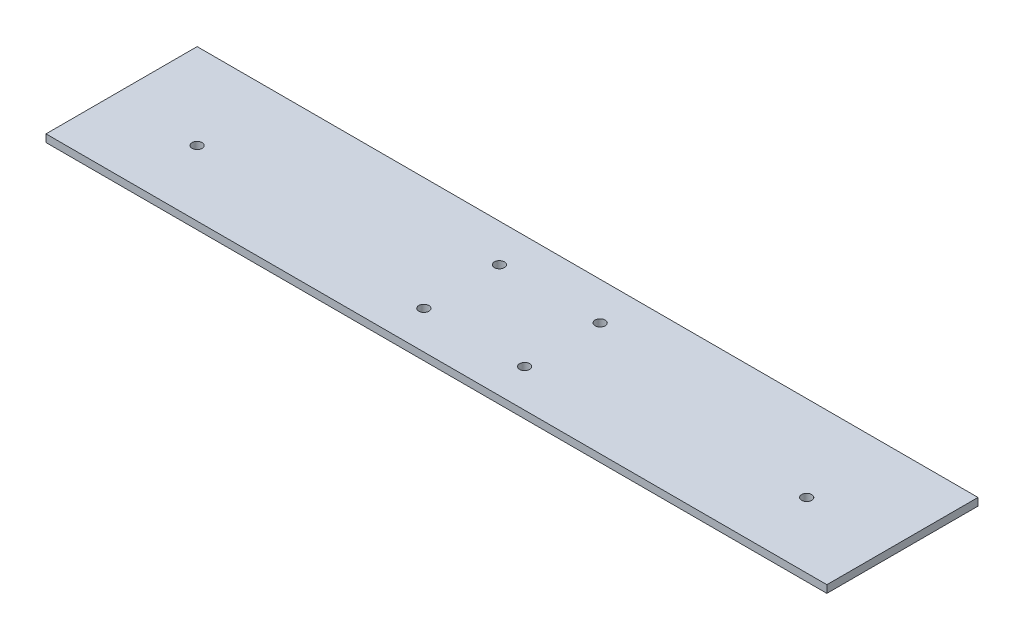
ISO-10303-21;
HEADER;
FILE_DESCRIPTION(('STEP AP214'),'2;1');
FILE_NAME('part.step','',(''),(''),'','','');
FILE_SCHEMA(('AUTOMOTIVE_DESIGN { 1 0 10303 214 1 1 1 1 }'));
ENDSEC;
DATA;
#1=APPLICATION_CONTEXT('core data for automotive mechanical design processes');
#2=APPLICATION_PROTOCOL_DEFINITION('international standard','automotive_design',2000,#1);
#3=PRODUCT_CONTEXT('',#1,'mechanical');
#4=PRODUCT('Part','Part','',(#3));
#5=PRODUCT_RELATED_PRODUCT_CATEGORY('part','',(#4));
#6=PRODUCT_DEFINITION_FORMATION('','',#4);
#7=PRODUCT_DEFINITION_CONTEXT('part definition',#1,'design');
#8=PRODUCT_DEFINITION('design','',#6,#7);
#9=PRODUCT_DEFINITION_SHAPE('','',#8);
#10=(LENGTH_UNIT() NAMED_UNIT(*) SI_UNIT(.MILLI.,.METRE.));
#11=(NAMED_UNIT(*) PLANE_ANGLE_UNIT() SI_UNIT($,.RADIAN.));
#12=(NAMED_UNIT(*) SI_UNIT($,.STERADIAN.) SOLID_ANGLE_UNIT());
#13=UNCERTAINTY_MEASURE_WITH_UNIT(LENGTH_MEASURE(1.E-05),#10,'distance_accuracy_value','');
#14=(GEOMETRIC_REPRESENTATION_CONTEXT(3) GLOBAL_UNCERTAINTY_ASSIGNED_CONTEXT((#13)) GLOBAL_UNIT_ASSIGNED_CONTEXT((#10,
#11,#12)) REPRESENTATION_CONTEXT('',''));
#15=CARTESIAN_POINT('',(0.,0.,0.));
#16=DIRECTION('',(0.,0.,1.));
#17=DIRECTION('',(1.,0.,0.));
#18=AXIS2_PLACEMENT_3D('',#15,#16,#17);
#19=CARTESIAN_POINT('',(0.,0.,0.));
#20=DIRECTION('',(0.,-1.,0.));
#21=DIRECTION('',(0.,0.,-1.));
#22=AXIS2_PLACEMENT_3D('',#19,#20,#21);
#23=PLANE('',#22);
#24=CARTESIAN_POINT('',(266.,0.,-26.));
#25=DIRECTION('',(0.,-1.,0.));
#26=DIRECTION('',(0.,0.,-1.));
#27=AXIS2_PLACEMENT_3D('',#24,#25,#26);
#28=CIRCLE('',#27,3.50000000000002);
#29=CARTESIAN_POINT('',(266.,0.,-29.5));
#30=VERTEX_POINT('',#29);
#31=EDGE_CURVE('E61',#30,#30,#28,.F.);
#32=ORIENTED_EDGE('',*,*,#31,.T.);
#33=EDGE_LOOP('',(#32));
#34=FACE_BOUND('',#33,.T.);
#35=CARTESIAN_POINT('',(125.,0.,-15.));
#36=DIRECTION('',(0.,1.,0.));
#37=DIRECTION('',(0.,0.,1.));
#38=AXIS2_PLACEMENT_3D('',#35,#36,#37);
#39=CIRCLE('',#38,2.);
#40=CARTESIAN_POINT('',(125.,0.,-13.));
#41=VERTEX_POINT('',#40);
#42=EDGE_CURVE('E180',#41,#41,#39,.T.);
#43=ORIENTED_EDGE('',*,*,#42,.T.);
#44=EDGE_LOOP('',(#43));
#45=FACE_BOUND('',#44,.T.);
#46=CARTESIAN_POINT('',(165.,0.,-15.));
#47=DIRECTION('',(0.,1.,0.));
#48=DIRECTION('',(0.,0.,1.));
#49=AXIS2_PLACEMENT_3D('',#46,#47,#48);
#50=CIRCLE('',#49,2.);
#51=CARTESIAN_POINT('',(165.,0.,-13.));
#52=VERTEX_POINT('',#51);
#53=EDGE_CURVE('E186',#52,#52,#50,.T.);
#54=ORIENTED_EDGE('',*,*,#53,.T.);
#55=EDGE_LOOP('',(#54));
#56=FACE_BOUND('',#55,.T.);
#57=CARTESIAN_POINT('',(165.,0.,-45.));
#58=DIRECTION('',(0.,1.,0.));
#59=DIRECTION('',(0.,0.,1.));
#60=AXIS2_PLACEMENT_3D('',#57,#58,#59);
#61=CIRCLE('',#60,2.);
#62=CARTESIAN_POINT('',(165.,0.,-43.));
#63=VERTEX_POINT('',#62);
#64=EDGE_CURVE('E170',#63,#63,#61,.T.);
#65=ORIENTED_EDGE('',*,*,#64,.T.);
#66=EDGE_LOOP('',(#65));
#67=FACE_BOUND('',#66,.T.);
#68=CARTESIAN_POINT('',(125.,0.,-45.));
#69=DIRECTION('',(0.,1.,0.));
#70=DIRECTION('',(0.,0.,1.));
#71=AXIS2_PLACEMENT_3D('',#68,#69,#70);
#72=CIRCLE('',#71,2.);
#73=CARTESIAN_POINT('',(125.,0.,-43.));
#74=VERTEX_POINT('',#73);
#75=EDGE_CURVE('E123',#74,#74,#72,.T.);
#76=ORIENTED_EDGE('',*,*,#75,.T.);
#77=EDGE_LOOP('',(#76));
#78=FACE_BOUND('',#77,.T.);
#79=DIRECTION('',(0.,0.,1.));
#80=VECTOR('',#79,1.);
#81=CARTESIAN_POINT('',(-10.,0.,0.));
#82=LINE('',#81,#80);
#83=CARTESIAN_POINT('',(-10.,0.,-60.));
#84=VERTEX_POINT('',#83);
#85=CARTESIAN_POINT('',(-10.,0.,0.));
#86=VERTEX_POINT('',#85);
#87=EDGE_CURVE('E120',#84,#86,#82,.T.);
#88=ORIENTED_EDGE('',*,*,#87,.F.);
#89=DIRECTION('',(-1.,0.,0.));
#90=VECTOR('',#89,1.);
#91=CARTESIAN_POINT('',(-10.,0.,-60.));
#92=LINE('',#91,#90);
#93=CARTESIAN_POINT('',(300.,0.,-60.));
#94=VERTEX_POINT('',#93);
#95=EDGE_CURVE('E92',#94,#84,#92,.T.);
#96=ORIENTED_EDGE('',*,*,#95,.F.);
#97=DIRECTION('',(0.,0.,-1.));
#98=VECTOR('',#97,1.);
#99=CARTESIAN_POINT('',(300.,0.,0.));
#100=LINE('',#99,#98);
#101=CARTESIAN_POINT('',(300.,0.,0.));
#102=VERTEX_POINT('',#101);
#103=EDGE_CURVE('E86',#102,#94,#100,.T.);
#104=ORIENTED_EDGE('',*,*,#103,.F.);
#105=DIRECTION('',(1.,0.,0.));
#106=VECTOR('',#105,1.);
#107=CARTESIAN_POINT('',(-10.,0.,0.));
#108=LINE('',#107,#106);
#109=EDGE_CURVE('E110',#86,#102,#108,.T.);
#110=ORIENTED_EDGE('',*,*,#109,.F.);
#111=EDGE_LOOP('',(#88,#96,#104,#110));
#112=FACE_BOUND('',#111,.T.);
#113=CARTESIAN_POINT('',(24.,0.,-26.));
#114=DIRECTION('',(0.,-1.,0.));
#115=DIRECTION('',(0.,0.,-1.));
#116=AXIS2_PLACEMENT_3D('',#113,#114,#115);
#117=CIRCLE('',#116,3.5);
#118=CARTESIAN_POINT('',(24.,0.,-29.5));
#119=VERTEX_POINT('',#118);
#120=EDGE_CURVE('E12',#119,#119,#117,.F.);
#121=ORIENTED_EDGE('',*,*,#120,.T.);
#122=EDGE_LOOP('',(#121));
#123=FACE_BOUND('',#122,.T.);
#124=ADVANCED_FACE('F51',(#34,#45,#56,#67,#78,#112,#123),#23,.T.);
#125=ORIENTED_EDGE('',*,*,#120,.F.);
#126=EDGE_LOOP('',(#125));
#127=FACE_BOUND('',#126,.T.);
#128=CARTESIAN_POINT('',(24.,0.,-26.));
#129=DIRECTION('',(0.,1.,0.));
#130=DIRECTION('',(0.,0.,1.));
#131=AXIS2_PLACEMENT_3D('',#128,#129,#130);
#132=CIRCLE('',#131,2.);
#133=CARTESIAN_POINT('',(24.,0.,-24.));
#134=VERTEX_POINT('',#133);
#135=EDGE_CURVE('E151',#134,#134,#132,.T.);
#136=ORIENTED_EDGE('',*,*,#135,.T.);
#137=EDGE_LOOP('',(#136));
#138=FACE_BOUND('',#137,.T.);
#139=ADVANCED_FACE('F142',(#127,#138),#23,.T.);
#140=CARTESIAN_POINT('',(-10.,3.,0.));
#141=DIRECTION('',(1.,0.,0.));
#142=DIRECTION('',(0.,0.,-1.));
#143=AXIS2_PLACEMENT_3D('',#140,#141,#142);
#144=PLANE('',#143);
#145=ORIENTED_EDGE('',*,*,#87,.T.);
#146=DIRECTION('',(0.,-1.,0.));
#147=VECTOR('',#146,1.);
#148=CARTESIAN_POINT('',(-10.,3.,0.));
#149=LINE('',#148,#147);
#150=CARTESIAN_POINT('',(-10.,3.,0.));
#151=VERTEX_POINT('',#150);
#152=EDGE_CURVE('E111',#151,#86,#149,.T.);
#153=ORIENTED_EDGE('',*,*,#152,.F.);
#154=DIRECTION('',(0.,0.,1.));
#155=VECTOR('',#154,1.);
#156=CARTESIAN_POINT('',(-10.,3.,0.));
#157=LINE('',#156,#155);
#158=CARTESIAN_POINT('',(-10.,3.,-60.));
#159=VERTEX_POINT('',#158);
#160=EDGE_CURVE('E105',#159,#151,#157,.T.);
#161=ORIENTED_EDGE('',*,*,#160,.F.);
#162=DIRECTION('',(0.,-1.,0.));
#163=VECTOR('',#162,1.);
#164=CARTESIAN_POINT('',(-10.,3.,-60.));
#165=LINE('',#164,#163);
#166=EDGE_CURVE('E116',#159,#84,#165,.T.);
#167=ORIENTED_EDGE('',*,*,#166,.T.);
#168=EDGE_LOOP('',(#145,#153,#161,#167));
#169=FACE_BOUND('',#168,.T.);
#170=ADVANCED_FACE('F53',(#169),#144,.F.);
#171=CARTESIAN_POINT('',(-10.,3.,0.));
#172=DIRECTION('',(0.,0.,-1.));
#173=DIRECTION('',(-1.,0.,0.));
#174=AXIS2_PLACEMENT_3D('',#171,#172,#173);
#175=PLANE('',#174);
#176=ORIENTED_EDGE('',*,*,#109,.T.);
#177=DIRECTION('',(0.,-1.,0.));
#178=VECTOR('',#177,1.);
#179=CARTESIAN_POINT('',(300.,3.,0.));
#180=LINE('',#179,#178);
#181=CARTESIAN_POINT('',(300.,3.,0.));
#182=VERTEX_POINT('',#181);
#183=EDGE_CURVE('E108',#182,#102,#180,.T.);
#184=ORIENTED_EDGE('',*,*,#183,.F.);
#185=DIRECTION('',(1.,0.,0.));
#186=VECTOR('',#185,1.);
#187=CARTESIAN_POINT('',(-10.,3.,0.));
#188=LINE('',#187,#186);
#189=EDGE_CURVE('E100',#151,#182,#188,.T.);
#190=ORIENTED_EDGE('',*,*,#189,.F.);
#191=ORIENTED_EDGE('',*,*,#152,.T.);
#192=EDGE_LOOP('',(#176,#184,#190,#191));
#193=FACE_BOUND('',#192,.T.);
#194=ADVANCED_FACE('F109',(#193),#175,.F.);
#195=CARTESIAN_POINT('',(300.,3.,0.));
#196=DIRECTION('',(-1.,0.,0.));
#197=DIRECTION('',(0.,0.,1.));
#198=AXIS2_PLACEMENT_3D('',#195,#196,#197);
#199=PLANE('',#198);
#200=ORIENTED_EDGE('',*,*,#103,.T.);
#201=DIRECTION('',(0.,-1.,0.));
#202=VECTOR('',#201,1.);
#203=CARTESIAN_POINT('',(300.,3.,-60.));
#204=LINE('',#203,#202);
#205=CARTESIAN_POINT('',(300.,3.,-60.));
#206=VERTEX_POINT('',#205);
#207=EDGE_CURVE('E112',#206,#94,#204,.T.);
#208=ORIENTED_EDGE('',*,*,#207,.F.);
#209=DIRECTION('',(0.,0.,-1.));
#210=VECTOR('',#209,1.);
#211=CARTESIAN_POINT('',(300.,3.,0.));
#212=LINE('',#211,#210);
#213=EDGE_CURVE('E103',#182,#206,#212,.T.);
#214=ORIENTED_EDGE('',*,*,#213,.F.);
#215=ORIENTED_EDGE('',*,*,#183,.T.);
#216=EDGE_LOOP('',(#200,#208,#214,#215));
#217=FACE_BOUND('',#216,.T.);
#218=ADVANCED_FACE('F114',(#217),#199,.F.);
#219=CARTESIAN_POINT('',(-10.,3.,-60.));
#220=DIRECTION('',(0.,0.,1.));
#221=DIRECTION('',(1.,0.,0.));
#222=AXIS2_PLACEMENT_3D('',#219,#220,#221);
#223=PLANE('',#222);
#224=ORIENTED_EDGE('',*,*,#95,.T.);
#225=ORIENTED_EDGE('',*,*,#166,.F.);
#226=DIRECTION('',(-1.,0.,0.));
#227=VECTOR('',#226,1.);
#228=CARTESIAN_POINT('',(-10.,3.,-60.));
#229=LINE('',#228,#227);
#230=EDGE_CURVE('E69',#206,#159,#229,.T.);
#231=ORIENTED_EDGE('',*,*,#230,.F.);
#232=ORIENTED_EDGE('',*,*,#207,.T.);
#233=EDGE_LOOP('',(#224,#225,#231,#232));
#234=FACE_BOUND('',#233,.T.);
#235=ADVANCED_FACE('F218',(#234),#223,.F.);
#236=CARTESIAN_POINT('',(0.,3.,0.));
#237=DIRECTION('',(0.,-1.,0.));
#238=DIRECTION('',(0.,0.,-1.));
#239=AXIS2_PLACEMENT_3D('',#236,#237,#238);
#240=PLANE('',#239);
#241=CARTESIAN_POINT('',(266.,3.,-26.));
#242=DIRECTION('',(0.,1.,0.));
#243=DIRECTION('',(0.,0.,1.));
#244=AXIS2_PLACEMENT_3D('',#241,#242,#243);
#245=CIRCLE('',#244,2.);
#246=CARTESIAN_POINT('',(266.,3.,-24.));
#247=VERTEX_POINT('',#246);
#248=EDGE_CURVE('E148',#247,#247,#245,.T.);
#249=ORIENTED_EDGE('',*,*,#248,.F.);
#250=EDGE_LOOP('',(#249));
#251=FACE_BOUND('',#250,.T.);
#252=CARTESIAN_POINT('',(24.,3.,-26.));
#253=DIRECTION('',(0.,1.,0.));
#254=DIRECTION('',(0.,0.,1.));
#255=AXIS2_PLACEMENT_3D('',#252,#253,#254);
#256=CIRCLE('',#255,2.);
#257=CARTESIAN_POINT('',(24.,3.,-24.));
#258=VERTEX_POINT('',#257);
#259=EDGE_CURVE('E147',#258,#258,#256,.T.);
#260=ORIENTED_EDGE('',*,*,#259,.F.);
#261=EDGE_LOOP('',(#260));
#262=FACE_BOUND('',#261,.T.);
#263=CARTESIAN_POINT('',(125.,3.,-15.));
#264=DIRECTION('',(0.,1.,0.));
#265=DIRECTION('',(0.,0.,1.));
#266=AXIS2_PLACEMENT_3D('',#263,#264,#265);
#267=CIRCLE('',#266,2.);
#268=CARTESIAN_POINT('',(125.,3.,-13.));
#269=VERTEX_POINT('',#268);
#270=EDGE_CURVE('E159',#269,#269,#267,.T.);
#271=ORIENTED_EDGE('',*,*,#270,.F.);
#272=EDGE_LOOP('',(#271));
#273=FACE_BOUND('',#272,.T.);
#274=CARTESIAN_POINT('',(165.,3.,-15.));
#275=DIRECTION('',(0.,1.,0.));
#276=DIRECTION('',(0.,0.,1.));
#277=AXIS2_PLACEMENT_3D('',#274,#275,#276);
#278=CIRCLE('',#277,2.);
#279=CARTESIAN_POINT('',(165.,3.,-13.));
#280=VERTEX_POINT('',#279);
#281=EDGE_CURVE('E184',#280,#280,#278,.T.);
#282=ORIENTED_EDGE('',*,*,#281,.F.);
#283=EDGE_LOOP('',(#282));
#284=FACE_BOUND('',#283,.T.);
#285=CARTESIAN_POINT('',(165.,3.,-45.));
#286=DIRECTION('',(0.,1.,0.));
#287=DIRECTION('',(0.,0.,1.));
#288=AXIS2_PLACEMENT_3D('',#285,#286,#287);
#289=CIRCLE('',#288,2.);
#290=CARTESIAN_POINT('',(165.,3.,-43.));
#291=VERTEX_POINT('',#290);
#292=EDGE_CURVE('E189',#291,#291,#289,.T.);
#293=ORIENTED_EDGE('',*,*,#292,.F.);
#294=EDGE_LOOP('',(#293));
#295=FACE_BOUND('',#294,.T.);
#296=CARTESIAN_POINT('',(125.,3.,-45.));
#297=DIRECTION('',(0.,1.,0.));
#298=DIRECTION('',(0.,0.,1.));
#299=AXIS2_PLACEMENT_3D('',#296,#297,#298);
#300=CIRCLE('',#299,2.);
#301=CARTESIAN_POINT('',(125.,3.,-43.));
#302=VERTEX_POINT('',#301);
#303=EDGE_CURVE('E166',#302,#302,#300,.T.);
#304=ORIENTED_EDGE('',*,*,#303,.F.);
#305=EDGE_LOOP('',(#304));
#306=FACE_BOUND('',#305,.T.);
#307=ORIENTED_EDGE('',*,*,#160,.T.);
#308=ORIENTED_EDGE('',*,*,#189,.T.);
#309=ORIENTED_EDGE('',*,*,#213,.T.);
#310=ORIENTED_EDGE('',*,*,#230,.T.);
#311=EDGE_LOOP('',(#307,#308,#309,#310));
#312=FACE_BOUND('',#311,.T.);
#313=ADVANCED_FACE('F101',(#251,#262,#273,#284,#295,#306,#312),#240,.F.);
#314=ORIENTED_EDGE('',*,*,#31,.F.);
#315=EDGE_LOOP('',(#314));
#316=FACE_BOUND('',#315,.T.);
#317=CARTESIAN_POINT('',(266.,0.,-26.));
#318=DIRECTION('',(0.,1.,0.));
#319=DIRECTION('',(0.,0.,1.));
#320=AXIS2_PLACEMENT_3D('',#317,#318,#319);
#321=CIRCLE('',#320,2.);
#322=CARTESIAN_POINT('',(266.,0.,-24.));
#323=VERTEX_POINT('',#322);
#324=EDGE_CURVE('E145',#323,#323,#321,.T.);
#325=ORIENTED_EDGE('',*,*,#324,.T.);
#326=EDGE_LOOP('',(#325));
#327=FACE_BOUND('',#326,.T.);
#328=ADVANCED_FACE('F137',(#316,#327),#23,.T.);
#329=CARTESIAN_POINT('',(125.,3.,-45.));
#330=DIRECTION('',(0.,1.,0.));
#331=DIRECTION('',(0.,0.,1.));
#332=AXIS2_PLACEMENT_3D('',#329,#330,#331);
#333=CYLINDRICAL_SURFACE('',#332,2.);
#334=ORIENTED_EDGE('',*,*,#75,.F.);
#335=EDGE_LOOP('',(#334));
#336=FACE_BOUND('',#335,.T.);
#337=ORIENTED_EDGE('',*,*,#303,.T.);
#338=EDGE_LOOP('',(#337));
#339=FACE_BOUND('',#338,.T.);
#340=ADVANCED_FACE('F140',(#336,#339),#333,.F.);
#341=CARTESIAN_POINT('',(165.,3.,-45.));
#342=DIRECTION('',(0.,1.,0.));
#343=DIRECTION('',(0.,0.,1.));
#344=AXIS2_PLACEMENT_3D('',#341,#342,#343);
#345=CYLINDRICAL_SURFACE('',#344,2.);
#346=ORIENTED_EDGE('',*,*,#64,.F.);
#347=EDGE_LOOP('',(#346));
#348=FACE_BOUND('',#347,.T.);
#349=ORIENTED_EDGE('',*,*,#292,.T.);
#350=EDGE_LOOP('',(#349));
#351=FACE_BOUND('',#350,.T.);
#352=ADVANCED_FACE('F198',(#348,#351),#345,.F.);
#353=CARTESIAN_POINT('',(165.,3.,-15.));
#354=DIRECTION('',(0.,1.,0.));
#355=DIRECTION('',(0.,0.,1.));
#356=AXIS2_PLACEMENT_3D('',#353,#354,#355);
#357=CYLINDRICAL_SURFACE('',#356,2.);
#358=ORIENTED_EDGE('',*,*,#53,.F.);
#359=EDGE_LOOP('',(#358));
#360=FACE_BOUND('',#359,.T.);
#361=ORIENTED_EDGE('',*,*,#281,.T.);
#362=EDGE_LOOP('',(#361));
#363=FACE_BOUND('',#362,.T.);
#364=ADVANCED_FACE('F200',(#360,#363),#357,.F.);
#365=CARTESIAN_POINT('',(125.,3.,-15.));
#366=DIRECTION('',(0.,1.,0.));
#367=DIRECTION('',(0.,0.,1.));
#368=AXIS2_PLACEMENT_3D('',#365,#366,#367);
#369=CYLINDRICAL_SURFACE('',#368,2.);
#370=ORIENTED_EDGE('',*,*,#42,.F.);
#371=EDGE_LOOP('',(#370));
#372=FACE_BOUND('',#371,.T.);
#373=ORIENTED_EDGE('',*,*,#270,.T.);
#374=EDGE_LOOP('',(#373));
#375=FACE_BOUND('',#374,.T.);
#376=ADVANCED_FACE('F206',(#372,#375),#369,.F.);
#377=CARTESIAN_POINT('',(24.,3.,-26.));
#378=DIRECTION('',(0.,1.,0.));
#379=DIRECTION('',(0.,0.,1.));
#380=AXIS2_PLACEMENT_3D('',#377,#378,#379);
#381=CYLINDRICAL_SURFACE('',#380,2.);
#382=ORIENTED_EDGE('',*,*,#135,.F.);
#383=EDGE_LOOP('',(#382));
#384=FACE_BOUND('',#383,.T.);
#385=ORIENTED_EDGE('',*,*,#259,.T.);
#386=EDGE_LOOP('',(#385));
#387=FACE_BOUND('',#386,.T.);
#388=ADVANCED_FACE('F236',(#384,#387),#381,.F.);
#389=CARTESIAN_POINT('',(266.,3.,-26.));
#390=DIRECTION('',(0.,1.,0.));
#391=DIRECTION('',(0.,0.,1.));
#392=AXIS2_PLACEMENT_3D('',#389,#390,#391);
#393=CYLINDRICAL_SURFACE('',#392,2.);
#394=ORIENTED_EDGE('',*,*,#324,.F.);
#395=EDGE_LOOP('',(#394));
#396=FACE_BOUND('',#395,.T.);
#397=ORIENTED_EDGE('',*,*,#248,.T.);
#398=EDGE_LOOP('',(#397));
#399=FACE_BOUND('',#398,.T.);
#400=ADVANCED_FACE('F239',(#396,#399),#393,.F.);
#401=CLOSED_SHELL('',(#124,#139,#170,#194,#218,#235,#313,#328,#340,#352,#364,#376,#388,#400));
#402=MANIFOLD_SOLID_BREP('B2',#401);
#403=ADVANCED_BREP_SHAPE_REPRESENTATION('',(#18,#402),#14);
#404=SHAPE_DEFINITION_REPRESENTATION(#9,#403);
ENDSEC;
END-ISO-10303-21;
